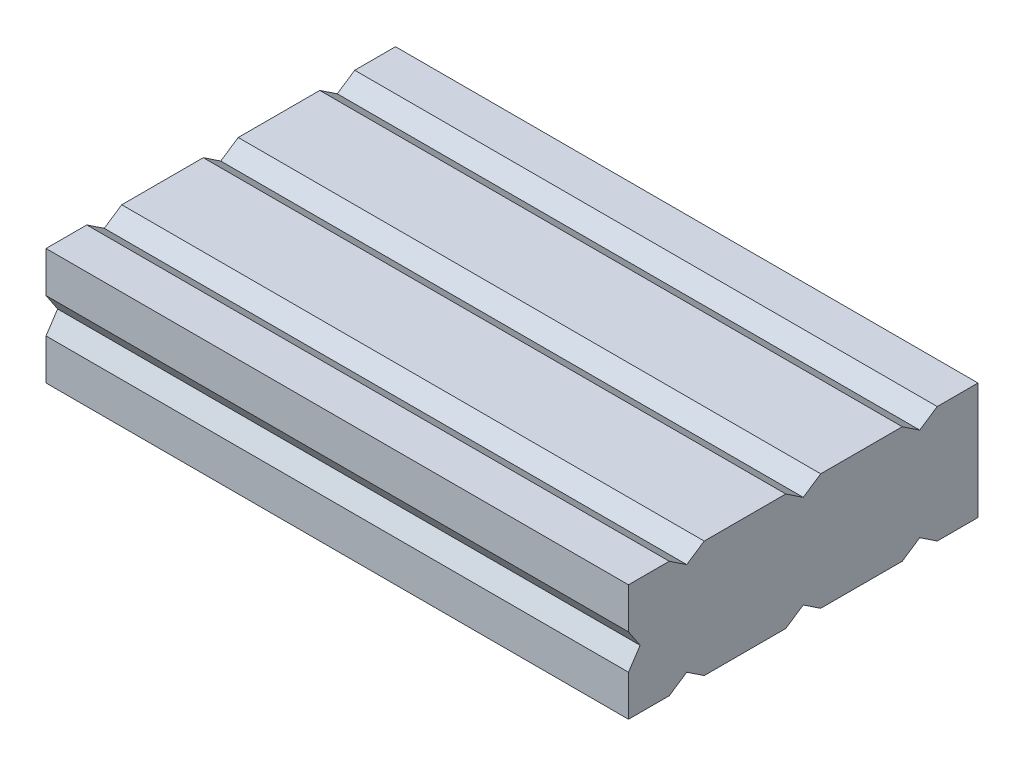
ISO-10303-21;
HEADER;
FILE_DESCRIPTION(('STEP AP214'),'2;1');
FILE_NAME('part.step','',(''),(''),'','','');
FILE_SCHEMA(('AUTOMOTIVE_DESIGN { 1 0 10303 214 1 1 1 1 }'));
ENDSEC;
DATA;
#1=APPLICATION_CONTEXT('core data for automotive mechanical design processes');
#2=APPLICATION_PROTOCOL_DEFINITION('international standard','automotive_design',2000,#1);
#3=PRODUCT_CONTEXT('',#1,'mechanical');
#4=PRODUCT('Part','Part','',(#3));
#5=PRODUCT_RELATED_PRODUCT_CATEGORY('part','',(#4));
#6=PRODUCT_DEFINITION_FORMATION('','',#4);
#7=PRODUCT_DEFINITION_CONTEXT('part definition',#1,'design');
#8=PRODUCT_DEFINITION('design','',#6,#7);
#9=PRODUCT_DEFINITION_SHAPE('','',#8);
#10=(LENGTH_UNIT() NAMED_UNIT(*) SI_UNIT(.MILLI.,.METRE.));
#11=(NAMED_UNIT(*) PLANE_ANGLE_UNIT() SI_UNIT($,.RADIAN.));
#12=(NAMED_UNIT(*) SI_UNIT($,.STERADIAN.) SOLID_ANGLE_UNIT());
#13=UNCERTAINTY_MEASURE_WITH_UNIT(LENGTH_MEASURE(1.E-05),#10,'distance_accuracy_value','');
#14=(GEOMETRIC_REPRESENTATION_CONTEXT(3) GLOBAL_UNCERTAINTY_ASSIGNED_CONTEXT((#13)) GLOBAL_UNIT_ASSIGNED_CONTEXT((#10,
#11,#12)) REPRESENTATION_CONTEXT('',''));
#15=CARTESIAN_POINT('',(0.,0.,0.));
#16=DIRECTION('',(0.,0.,1.));
#17=DIRECTION('',(1.,0.,0.));
#18=AXIS2_PLACEMENT_3D('',#15,#16,#17);
#19=CARTESIAN_POINT('',(100.,-10.,0.));
#20=DIRECTION('',(0.,1.,0.));
#21=DIRECTION('',(0.,0.,1.));
#22=AXIS2_PLACEMENT_3D('',#19,#20,#21);
#23=PLANE('',#22);
#24=DIRECTION('',(0.,0.,-1.));
#25=VECTOR('',#24,1.);
#26=CARTESIAN_POINT('',(0.,-10.,0.));
#27=LINE('',#26,#25);
#28=CARTESIAN_POINT('',(0.,-10.,-13.));
#29=VERTEX_POINT('',#28);
#30=CARTESIAN_POINT('',(0.,-10.,-20.));
#31=VERTEX_POINT('',#30);
#32=EDGE_CURVE('E235',#29,#31,#27,.T.);
#33=ORIENTED_EDGE('',*,*,#32,.T.);
#34=DIRECTION('',(-1.,0.,0.));
#35=VECTOR('',#34,1.);
#36=CARTESIAN_POINT('',(100.,-10.,-20.));
#37=LINE('',#36,#35);
#38=CARTESIAN_POINT('',(100.,-10.,-20.));
#39=VERTEX_POINT('',#38);
#40=EDGE_CURVE('E11',#39,#31,#37,.T.);
#41=ORIENTED_EDGE('',*,*,#40,.F.);
#42=DIRECTION('',(0.,0.,-1.));
#43=VECTOR('',#42,1.);
#44=CARTESIAN_POINT('',(100.,-10.,0.));
#45=LINE('',#44,#43);
#46=CARTESIAN_POINT('',(100.,-10.,-13.));
#47=VERTEX_POINT('',#46);
#48=EDGE_CURVE('E307',#47,#39,#45,.T.);
#49=ORIENTED_EDGE('',*,*,#48,.F.);
#50=DIRECTION('',(-1.,0.,0.));
#51=VECTOR('',#50,1.);
#52=CARTESIAN_POINT('',(100.,-10.,-13.));
#53=LINE('',#52,#51);
#54=EDGE_CURVE('E53',#47,#29,#53,.T.);
#55=ORIENTED_EDGE('',*,*,#54,.T.);
#56=EDGE_LOOP('',(#33,#41,#49,#55));
#57=FACE_BOUND('',#56,.T.);
#58=ADVANCED_FACE('F36',(#57),#23,.F.);
#59=CARTESIAN_POINT('',(100.,0.,-20.));
#60=DIRECTION('',(0.,0.,1.));
#61=DIRECTION('',(1.,0.,0.));
#62=AXIS2_PLACEMENT_3D('',#59,#60,#61);
#63=PLANE('',#62);
#64=DIRECTION('',(0.,1.,0.));
#65=VECTOR('',#64,1.);
#66=CARTESIAN_POINT('',(0.,0.,-20.));
#67=LINE('',#66,#65);
#68=CARTESIAN_POINT('',(0.,10.,-20.));
#69=VERTEX_POINT('',#68);
#70=EDGE_CURVE('E237',#31,#69,#67,.T.);
#71=ORIENTED_EDGE('',*,*,#70,.T.);
#72=DIRECTION('',(-1.,0.,0.));
#73=VECTOR('',#72,1.);
#74=CARTESIAN_POINT('',(100.,10.,-20.));
#75=LINE('',#74,#73);
#76=CARTESIAN_POINT('',(100.,10.,-20.));
#77=VERTEX_POINT('',#76);
#78=EDGE_CURVE('E45',#77,#69,#75,.T.);
#79=ORIENTED_EDGE('',*,*,#78,.F.);
#80=DIRECTION('',(0.,1.,0.));
#81=VECTOR('',#80,1.);
#82=CARTESIAN_POINT('',(100.,0.,-20.));
#83=LINE('',#82,#81);
#84=EDGE_CURVE('E143',#39,#77,#83,.T.);
#85=ORIENTED_EDGE('',*,*,#84,.F.);
#86=ORIENTED_EDGE('',*,*,#40,.T.);
#87=EDGE_LOOP('',(#71,#79,#85,#86));
#88=FACE_BOUND('',#87,.T.);
#89=ADVANCED_FACE('F371',(#88),#63,.F.);
#90=CARTESIAN_POINT('',(100.,10.,0.));
#91=DIRECTION('',(0.,1.,0.));
#92=DIRECTION('',(0.,0.,1.));
#93=AXIS2_PLACEMENT_3D('',#90,#91,#92);
#94=PLANE('',#93);
#95=DIRECTION('',(0.,0.,-1.));
#96=VECTOR('',#95,1.);
#97=CARTESIAN_POINT('',(0.,10.,0.));
#98=LINE('',#97,#96);
#99=CARTESIAN_POINT('',(0.,10.,-13.));
#100=VERTEX_POINT('',#99);
#101=EDGE_CURVE('E240',#100,#69,#98,.T.);
#102=ORIENTED_EDGE('',*,*,#101,.F.);
#103=DIRECTION('',(-1.,0.,0.));
#104=VECTOR('',#103,1.);
#105=CARTESIAN_POINT('',(100.,10.,-13.));
#106=LINE('',#105,#104);
#107=CARTESIAN_POINT('',(100.,10.,-13.));
#108=VERTEX_POINT('',#107);
#109=EDGE_CURVE('E361',#108,#100,#106,.T.);
#110=ORIENTED_EDGE('',*,*,#109,.F.);
#111=DIRECTION('',(0.,0.,-1.));
#112=VECTOR('',#111,1.);
#113=CARTESIAN_POINT('',(100.,10.,0.));
#114=LINE('',#113,#112);
#115=EDGE_CURVE('E370',#108,#77,#114,.T.);
#116=ORIENTED_EDGE('',*,*,#115,.T.);
#117=ORIENTED_EDGE('',*,*,#78,.T.);
#118=EDGE_LOOP('',(#102,#110,#116,#117));
#119=FACE_BOUND('',#118,.T.);
#120=ADVANCED_FACE('F368',(#119),#94,.T.);
#121=CARTESIAN_POINT('',(100.,0.923076923076924,0.615384615384616));
#122=DIRECTION('',(0.,-0.832050294337844,-0.554700196225229));
#123=DIRECTION('',(0.,0.554700196225229,-0.832050294337844));
#124=AXIS2_PLACEMENT_3D('',#121,#122,#123);
#125=PLANE('',#124);
#126=DIRECTION('',(0.,-0.554700196225229,0.832050294337844));
#127=VECTOR('',#126,1.);
#128=CARTESIAN_POINT('',(0.,0.923076923076924,0.615384615384616));
#129=LINE('',#128,#127);
#130=CARTESIAN_POINT('',(0.,8.,-10.));
#131=VERTEX_POINT('',#130);
#132=EDGE_CURVE('E243',#100,#131,#129,.T.);
#133=ORIENTED_EDGE('',*,*,#132,.T.);
#134=DIRECTION('',(-1.,0.,0.));
#135=VECTOR('',#134,1.);
#136=CARTESIAN_POINT('',(100.,8.,-10.));
#137=LINE('',#136,#135);
#138=CARTESIAN_POINT('',(100.,8.,-10.));
#139=VERTEX_POINT('',#138);
#140=EDGE_CURVE('E358',#139,#131,#137,.T.);
#141=ORIENTED_EDGE('',*,*,#140,.F.);
#142=DIRECTION('',(0.,-0.554700196225229,0.832050294337844));
#143=VECTOR('',#142,1.);
#144=CARTESIAN_POINT('',(100.,0.923076923076924,0.615384615384616));
#145=LINE('',#144,#143);
#146=EDGE_CURVE('E382',#108,#139,#145,.T.);
#147=ORIENTED_EDGE('',*,*,#146,.F.);
#148=ORIENTED_EDGE('',*,*,#109,.T.);
#149=EDGE_LOOP('',(#133,#141,#147,#148));
#150=FACE_BOUND('',#149,.T.);
#151=ADVANCED_FACE('F379',(#150),#125,.F.);
#152=CARTESIAN_POINT('',(100.,10.1538461538462,-6.76923076923077));
#153=DIRECTION('',(0.,0.832050294337844,-0.554700196225229));
#154=DIRECTION('',(0.,0.554700196225229,0.832050294337844));
#155=AXIS2_PLACEMENT_3D('',#152,#153,#154);
#156=PLANE('',#155);
#157=DIRECTION('',(0.,-0.554700196225229,-0.832050294337844));
#158=VECTOR('',#157,1.);
#159=CARTESIAN_POINT('',(0.,10.1538461538462,-6.76923076923077));
#160=LINE('',#159,#158);
#161=CARTESIAN_POINT('',(0.,10.,-7.00000000000001));
#162=VERTEX_POINT('',#161);
#163=EDGE_CURVE('E246',#162,#131,#160,.T.);
#164=ORIENTED_EDGE('',*,*,#163,.F.);
#165=DIRECTION('',(-1.,0.,0.));
#166=VECTOR('',#165,1.);
#167=CARTESIAN_POINT('',(100.,10.,-7.00000000000001));
#168=LINE('',#167,#166);
#169=CARTESIAN_POINT('',(100.,10.,-7.00000000000001));
#170=VERTEX_POINT('',#169);
#171=EDGE_CURVE('E355',#170,#162,#168,.T.);
#172=ORIENTED_EDGE('',*,*,#171,.F.);
#173=DIRECTION('',(0.,-0.554700196225229,-0.832050294337844));
#174=VECTOR('',#173,1.);
#175=CARTESIAN_POINT('',(100.,10.1538461538462,-6.76923076923077));
#176=LINE('',#175,#174);
#177=EDGE_CURVE('E384',#170,#139,#176,.T.);
#178=ORIENTED_EDGE('',*,*,#177,.T.);
#179=ORIENTED_EDGE('',*,*,#140,.T.);
#180=EDGE_LOOP('',(#164,#172,#178,#179));
#181=FACE_BOUND('',#180,.T.);
#182=ADVANCED_FACE('F459',(#181),#156,.T.);
#183=CARTESIAN_POINT('',(100.,10.,0.));
#184=DIRECTION('',(0.,1.,0.));
#185=DIRECTION('',(0.,0.,1.));
#186=AXIS2_PLACEMENT_3D('',#183,#184,#185);
#187=PLANE('',#186);
#188=DIRECTION('',(0.,0.,-1.));
#189=VECTOR('',#188,1.);
#190=CARTESIAN_POINT('',(0.,10.,0.));
#191=LINE('',#190,#189);
#192=CARTESIAN_POINT('',(0.,10.,6.99999999999999));
#193=VERTEX_POINT('',#192);
#194=EDGE_CURVE('E249',#193,#162,#191,.T.);
#195=ORIENTED_EDGE('',*,*,#194,.F.);
#196=DIRECTION('',(-1.,0.,0.));
#197=VECTOR('',#196,1.);
#198=CARTESIAN_POINT('',(100.,10.,6.99999999999999));
#199=LINE('',#198,#197);
#200=CARTESIAN_POINT('',(100.,10.,6.99999999999999));
#201=VERTEX_POINT('',#200);
#202=EDGE_CURVE('E352',#201,#193,#199,.T.);
#203=ORIENTED_EDGE('',*,*,#202,.F.);
#204=DIRECTION('',(0.,0.,-1.));
#205=VECTOR('',#204,1.);
#206=CARTESIAN_POINT('',(100.,10.,0.));
#207=LINE('',#206,#205);
#208=EDGE_CURVE('E392',#201,#170,#207,.T.);
#209=ORIENTED_EDGE('',*,*,#208,.T.);
#210=ORIENTED_EDGE('',*,*,#171,.T.);
#211=EDGE_LOOP('',(#195,#203,#209,#210));
#212=FACE_BOUND('',#211,.T.);
#213=ADVANCED_FACE('F462',(#212),#187,.T.);
#214=CARTESIAN_POINT('',(100.,10.1538461538462,6.76923076923076));
#215=DIRECTION('',(0.,-0.832050294337844,-0.554700196225229));
#216=DIRECTION('',(0.,0.554700196225229,-0.832050294337844));
#217=AXIS2_PLACEMENT_3D('',#214,#215,#216);
#218=PLANE('',#217);
#219=DIRECTION('',(0.,-0.554700196225229,0.832050294337844));
#220=VECTOR('',#219,1.);
#221=CARTESIAN_POINT('',(0.,10.1538461538462,6.76923076923076));
#222=LINE('',#221,#220);
#223=CARTESIAN_POINT('',(0.,8.,9.99999999999999));
#224=VERTEX_POINT('',#223);
#225=EDGE_CURVE('E253',#193,#224,#222,.T.);
#226=ORIENTED_EDGE('',*,*,#225,.T.);
#227=DIRECTION('',(-1.,0.,0.));
#228=VECTOR('',#227,1.);
#229=CARTESIAN_POINT('',(100.,8.,9.99999999999999));
#230=LINE('',#229,#228);
#231=CARTESIAN_POINT('',(100.,8.,9.99999999999999));
#232=VERTEX_POINT('',#231);
#233=EDGE_CURVE('E349',#232,#224,#230,.T.);
#234=ORIENTED_EDGE('',*,*,#233,.F.);
#235=DIRECTION('',(0.,-0.554700196225229,0.832050294337844));
#236=VECTOR('',#235,1.);
#237=CARTESIAN_POINT('',(100.,10.1538461538462,6.76923076923076));
#238=LINE('',#237,#236);
#239=EDGE_CURVE('E395',#201,#232,#238,.T.);
#240=ORIENTED_EDGE('',*,*,#239,.F.);
#241=ORIENTED_EDGE('',*,*,#202,.T.);
#242=EDGE_LOOP('',(#226,#234,#240,#241));
#243=FACE_BOUND('',#242,.T.);
#244=ADVANCED_FACE('F466',(#243),#218,.F.);
#245=CARTESIAN_POINT('',(100.,0.923076923076932,-0.615384615384621));
#246=DIRECTION('',(0.,0.832050294337844,-0.554700196225229));
#247=DIRECTION('',(0.,0.554700196225229,0.832050294337844));
#248=AXIS2_PLACEMENT_3D('',#245,#246,#247);
#249=PLANE('',#248);
#250=DIRECTION('',(0.,-0.554700196225229,-0.832050294337844));
#251=VECTOR('',#250,1.);
#252=CARTESIAN_POINT('',(0.,0.923076923076932,-0.615384615384621));
#253=LINE('',#252,#251);
#254=CARTESIAN_POINT('',(0.,10.,13.));
#255=VERTEX_POINT('',#254);
#256=EDGE_CURVE('E256',#255,#224,#253,.T.);
#257=ORIENTED_EDGE('',*,*,#256,.F.);
#258=DIRECTION('',(-1.,0.,0.));
#259=VECTOR('',#258,1.);
#260=CARTESIAN_POINT('',(100.,10.,13.));
#261=LINE('',#260,#259);
#262=CARTESIAN_POINT('',(100.,10.,13.));
#263=VERTEX_POINT('',#262);
#264=EDGE_CURVE('E347',#263,#255,#261,.T.);
#265=ORIENTED_EDGE('',*,*,#264,.F.);
#266=DIRECTION('',(0.,-0.554700196225229,-0.832050294337844));
#267=VECTOR('',#266,1.);
#268=CARTESIAN_POINT('',(100.,0.923076923076932,-0.615384615384621));
#269=LINE('',#268,#267);
#270=EDGE_CURVE('E397',#263,#232,#269,.T.);
#271=ORIENTED_EDGE('',*,*,#270,.T.);
#272=ORIENTED_EDGE('',*,*,#233,.T.);
#273=EDGE_LOOP('',(#257,#265,#271,#272));
#274=FACE_BOUND('',#273,.T.);
#275=ADVANCED_FACE('F470',(#274),#249,.T.);
#276=CARTESIAN_POINT('',(100.,10.,0.));
#277=DIRECTION('',(0.,1.,0.));
#278=DIRECTION('',(0.,0.,1.));
#279=AXIS2_PLACEMENT_3D('',#276,#277,#278);
#280=PLANE('',#279);
#281=DIRECTION('',(0.,0.,-1.));
#282=VECTOR('',#281,1.);
#283=CARTESIAN_POINT('',(0.,10.,0.));
#284=LINE('',#283,#282);
#285=CARTESIAN_POINT('',(0.,10.,27.));
#286=VERTEX_POINT('',#285);
#287=EDGE_CURVE('E259',#286,#255,#284,.T.);
#288=ORIENTED_EDGE('',*,*,#287,.F.);
#289=DIRECTION('',(-1.,0.,0.));
#290=VECTOR('',#289,1.);
#291=CARTESIAN_POINT('',(100.,10.,27.));
#292=LINE('',#291,#290);
#293=CARTESIAN_POINT('',(100.,10.,27.));
#294=VERTEX_POINT('',#293);
#295=EDGE_CURVE('E344',#294,#286,#292,.T.);
#296=ORIENTED_EDGE('',*,*,#295,.F.);
#297=DIRECTION('',(0.,0.,-1.));
#298=VECTOR('',#297,1.);
#299=CARTESIAN_POINT('',(100.,10.,0.));
#300=LINE('',#299,#298);
#301=EDGE_CURVE('E401',#294,#263,#300,.T.);
#302=ORIENTED_EDGE('',*,*,#301,.T.);
#303=ORIENTED_EDGE('',*,*,#264,.T.);
#304=EDGE_LOOP('',(#288,#296,#302,#303));
#305=FACE_BOUND('',#304,.T.);
#306=ADVANCED_FACE('F474',(#305),#280,.T.);
#307=CARTESIAN_POINT('',(100.,19.3846153846154,12.9230769230769));
#308=DIRECTION('',(0.,-0.832050294337844,-0.554700196225229));
#309=DIRECTION('',(0.,0.554700196225229,-0.832050294337844));
#310=AXIS2_PLACEMENT_3D('',#307,#308,#309);
#311=PLANE('',#310);
#312=DIRECTION('',(0.,-0.554700196225229,0.832050294337844));
#313=VECTOR('',#312,1.);
#314=CARTESIAN_POINT('',(0.,19.3846153846154,12.9230769230769));
#315=LINE('',#314,#313);
#316=CARTESIAN_POINT('',(0.,8.,30.));
#317=VERTEX_POINT('',#316);
#318=EDGE_CURVE('E263',#286,#317,#315,.T.);
#319=ORIENTED_EDGE('',*,*,#318,.T.);
#320=DIRECTION('',(-1.,0.,0.));
#321=VECTOR('',#320,1.);
#322=CARTESIAN_POINT('',(100.,8.,30.));
#323=LINE('',#322,#321);
#324=CARTESIAN_POINT('',(100.,8.,30.));
#325=VERTEX_POINT('',#324);
#326=EDGE_CURVE('E341',#325,#317,#323,.T.);
#327=ORIENTED_EDGE('',*,*,#326,.F.);
#328=DIRECTION('',(0.,-0.554700196225229,0.832050294337844));
#329=VECTOR('',#328,1.);
#330=CARTESIAN_POINT('',(100.,19.3846153846154,12.9230769230769));
#331=LINE('',#330,#329);
#332=EDGE_CURVE('E404',#294,#325,#331,.T.);
#333=ORIENTED_EDGE('',*,*,#332,.F.);
#334=ORIENTED_EDGE('',*,*,#295,.T.);
#335=EDGE_LOOP('',(#319,#327,#333,#334));
#336=FACE_BOUND('',#335,.T.);
#337=ADVANCED_FACE('F478',(#336),#311,.F.);
#338=CARTESIAN_POINT('',(100.,-8.3076923076923,5.53846153846153));
#339=DIRECTION('',(0.,0.832050294337844,-0.554700196225229));
#340=DIRECTION('',(0.,0.554700196225229,0.832050294337844));
#341=AXIS2_PLACEMENT_3D('',#338,#339,#340);
#342=PLANE('',#341);
#343=DIRECTION('',(0.,-0.554700196225229,-0.832050294337844));
#344=VECTOR('',#343,1.);
#345=CARTESIAN_POINT('',(0.,-8.3076923076923,5.53846153846153));
#346=LINE('',#345,#344);
#347=CARTESIAN_POINT('',(0.,10.,33.));
#348=VERTEX_POINT('',#347);
#349=EDGE_CURVE('E266',#348,#317,#346,.T.);
#350=ORIENTED_EDGE('',*,*,#349,.F.);
#351=DIRECTION('',(-1.,0.,0.));
#352=VECTOR('',#351,1.);
#353=CARTESIAN_POINT('',(100.,10.,33.));
#354=LINE('',#353,#352);
#355=CARTESIAN_POINT('',(100.,10.,33.));
#356=VERTEX_POINT('',#355);
#357=EDGE_CURVE('E339',#356,#348,#354,.T.);
#358=ORIENTED_EDGE('',*,*,#357,.F.);
#359=DIRECTION('',(0.,-0.554700196225229,-0.832050294337844));
#360=VECTOR('',#359,1.);
#361=CARTESIAN_POINT('',(100.,-8.3076923076923,5.53846153846153));
#362=LINE('',#361,#360);
#363=EDGE_CURVE('E406',#356,#325,#362,.T.);
#364=ORIENTED_EDGE('',*,*,#363,.T.);
#365=ORIENTED_EDGE('',*,*,#326,.T.);
#366=EDGE_LOOP('',(#350,#358,#364,#365));
#367=FACE_BOUND('',#366,.T.);
#368=ADVANCED_FACE('F482',(#367),#342,.T.);
#369=CARTESIAN_POINT('',(100.,10.,0.));
#370=DIRECTION('',(0.,1.,0.));
#371=DIRECTION('',(0.,0.,1.));
#372=AXIS2_PLACEMENT_3D('',#369,#370,#371);
#373=PLANE('',#372);
#374=DIRECTION('',(0.,0.,-1.));
#375=VECTOR('',#374,1.);
#376=CARTESIAN_POINT('',(0.,10.,0.));
#377=LINE('',#376,#375);
#378=CARTESIAN_POINT('',(0.,10.,40.));
#379=VERTEX_POINT('',#378);
#380=EDGE_CURVE('E269',#379,#348,#377,.T.);
#381=ORIENTED_EDGE('',*,*,#380,.F.);
#382=DIRECTION('',(-1.,0.,0.));
#383=VECTOR('',#382,1.);
#384=CARTESIAN_POINT('',(100.,10.,40.));
#385=LINE('',#384,#383);
#386=CARTESIAN_POINT('',(100.,10.,40.));
#387=VERTEX_POINT('',#386);
#388=EDGE_CURVE('E336',#387,#379,#385,.T.);
#389=ORIENTED_EDGE('',*,*,#388,.F.);
#390=DIRECTION('',(0.,0.,-1.));
#391=VECTOR('',#390,1.);
#392=CARTESIAN_POINT('',(100.,10.,0.));
#393=LINE('',#392,#391);
#394=EDGE_CURVE('E409',#387,#356,#393,.T.);
#395=ORIENTED_EDGE('',*,*,#394,.T.);
#396=ORIENTED_EDGE('',*,*,#357,.T.);
#397=EDGE_LOOP('',(#381,#389,#395,#396));
#398=FACE_BOUND('',#397,.T.);
#399=ADVANCED_FACE('F486',(#398),#373,.T.);
#400=CARTESIAN_POINT('',(100.,0.,40.));
#401=DIRECTION('',(0.,0.,1.));
#402=DIRECTION('',(1.,0.,0.));
#403=AXIS2_PLACEMENT_3D('',#400,#401,#402);
#404=PLANE('',#403);
#405=DIRECTION('',(0.,1.,0.));
#406=VECTOR('',#405,1.);
#407=CARTESIAN_POINT('',(0.,0.,40.));
#408=LINE('',#407,#406);
#409=CARTESIAN_POINT('',(0.,3.,40.));
#410=VERTEX_POINT('',#409);
#411=EDGE_CURVE('E272',#410,#379,#408,.T.);
#412=ORIENTED_EDGE('',*,*,#411,.F.);
#413=DIRECTION('',(-1.,0.,0.));
#414=VECTOR('',#413,1.);
#415=CARTESIAN_POINT('',(100.,3.,40.));
#416=LINE('',#415,#414);
#417=CARTESIAN_POINT('',(100.,3.,40.));
#418=VERTEX_POINT('',#417);
#419=EDGE_CURVE('E333',#418,#410,#416,.T.);
#420=ORIENTED_EDGE('',*,*,#419,.F.);
#421=DIRECTION('',(0.,1.,0.));
#422=VECTOR('',#421,1.);
#423=CARTESIAN_POINT('',(100.,0.,40.));
#424=LINE('',#423,#422);
#425=EDGE_CURVE('E412',#418,#387,#424,.T.);
#426=ORIENTED_EDGE('',*,*,#425,.T.);
#427=ORIENTED_EDGE('',*,*,#388,.T.);
#428=EDGE_LOOP('',(#412,#420,#426,#427));
#429=FACE_BOUND('',#428,.T.);
#430=ADVANCED_FACE('F490',(#429),#404,.T.);
#431=CARTESIAN_POINT('',(100.,-17.5384615384615,26.3076923076923));
#432=DIRECTION('',(0.,0.554700196225229,-0.832050294337843));
#433=DIRECTION('',(0.,0.832050294337843,0.554700196225229));
#434=AXIS2_PLACEMENT_3D('',#431,#432,#433);
#435=PLANE('',#434);
#436=DIRECTION('',(0.,-0.832050294337843,-0.554700196225229));
#437=VECTOR('',#436,1.);
#438=CARTESIAN_POINT('',(0.,-17.5384615384615,26.3076923076923));
#439=LINE('',#438,#437);
#440=CARTESIAN_POINT('',(0.,0.,38.));
#441=VERTEX_POINT('',#440);
#442=EDGE_CURVE('E275',#410,#441,#439,.T.);
#443=ORIENTED_EDGE('',*,*,#442,.T.);
#444=DIRECTION('',(-1.,0.,0.));
#445=VECTOR('',#444,1.);
#446=CARTESIAN_POINT('',(100.,0.,38.));
#447=LINE('',#446,#445);
#448=CARTESIAN_POINT('',(100.,0.,38.));
#449=VERTEX_POINT('',#448);
#450=EDGE_CURVE('E330',#449,#441,#447,.T.);
#451=ORIENTED_EDGE('',*,*,#450,.F.);
#452=DIRECTION('',(0.,-0.832050294337843,-0.554700196225229));
#453=VECTOR('',#452,1.);
#454=CARTESIAN_POINT('',(100.,-17.5384615384615,26.3076923076923));
#455=LINE('',#454,#453);
#456=EDGE_CURVE('E415',#418,#449,#455,.T.);
#457=ORIENTED_EDGE('',*,*,#456,.F.);
#458=ORIENTED_EDGE('',*,*,#419,.T.);
#459=EDGE_LOOP('',(#443,#451,#457,#458));
#460=FACE_BOUND('',#459,.T.);
#461=ADVANCED_FACE('F494',(#460),#435,.F.);
#462=CARTESIAN_POINT('',(100.,17.5384615384616,26.3076923076922));
#463=DIRECTION('',(0.,0.554700196225231,0.832050294337843));
#464=DIRECTION('',(0.,-0.832050294337843,0.554700196225231));
#465=AXIS2_PLACEMENT_3D('',#462,#463,#464);
#466=PLANE('',#465);
#467=DIRECTION('',(0.,0.832050294337843,-0.554700196225231));
#468=VECTOR('',#467,1.);
#469=CARTESIAN_POINT('',(0.,17.5384615384616,26.3076923076922));
#470=LINE('',#469,#468);
#471=CARTESIAN_POINT('',(0.,-3.,40.));
#472=VERTEX_POINT('',#471);
#473=EDGE_CURVE('E278',#472,#441,#470,.T.);
#474=ORIENTED_EDGE('',*,*,#473,.F.);
#475=DIRECTION('',(-1.,0.,0.));
#476=VECTOR('',#475,1.);
#477=CARTESIAN_POINT('',(100.,-3.,40.));
#478=LINE('',#477,#476);
#479=CARTESIAN_POINT('',(100.,-3.,40.));
#480=VERTEX_POINT('',#479);
#481=EDGE_CURVE('E327',#480,#472,#478,.T.);
#482=ORIENTED_EDGE('',*,*,#481,.F.);
#483=DIRECTION('',(0.,0.832050294337843,-0.554700196225231));
#484=VECTOR('',#483,1.);
#485=CARTESIAN_POINT('',(100.,17.5384615384616,26.3076923076922));
#486=LINE('',#485,#484);
#487=EDGE_CURVE('E417',#480,#449,#486,.T.);
#488=ORIENTED_EDGE('',*,*,#487,.T.);
#489=ORIENTED_EDGE('',*,*,#450,.T.);
#490=EDGE_LOOP('',(#474,#482,#488,#489));
#491=FACE_BOUND('',#490,.T.);
#492=ADVANCED_FACE('F498',(#491),#466,.T.);
#493=CARTESIAN_POINT('',(100.,0.,40.));
#494=DIRECTION('',(0.,0.,1.));
#495=DIRECTION('',(1.,0.,0.));
#496=AXIS2_PLACEMENT_3D('',#493,#494,#495);
#497=PLANE('',#496);
#498=DIRECTION('',(0.,1.,0.));
#499=VECTOR('',#498,1.);
#500=CARTESIAN_POINT('',(0.,0.,40.));
#501=LINE('',#500,#499);
#502=CARTESIAN_POINT('',(0.,-10.,40.));
#503=VERTEX_POINT('',#502);
#504=EDGE_CURVE('E281',#503,#472,#501,.T.);
#505=ORIENTED_EDGE('',*,*,#504,.F.);
#506=DIRECTION('',(-1.,0.,0.));
#507=VECTOR('',#506,1.);
#508=CARTESIAN_POINT('',(100.,-10.,40.));
#509=LINE('',#508,#507);
#510=CARTESIAN_POINT('',(100.,-10.,40.));
#511=VERTEX_POINT('',#510);
#512=EDGE_CURVE('E325',#511,#503,#509,.T.);
#513=ORIENTED_EDGE('',*,*,#512,.F.);
#514=DIRECTION('',(0.,1.,0.));
#515=VECTOR('',#514,1.);
#516=CARTESIAN_POINT('',(100.,0.,40.));
#517=LINE('',#516,#515);
#518=EDGE_CURVE('E420',#511,#480,#517,.T.);
#519=ORIENTED_EDGE('',*,*,#518,.T.);
#520=ORIENTED_EDGE('',*,*,#481,.T.);
#521=EDGE_LOOP('',(#505,#513,#519,#520));
#522=FACE_BOUND('',#521,.T.);
#523=ADVANCED_FACE('F502',(#522),#497,.T.);
#524=CARTESIAN_POINT('',(100.,-10.,0.));
#525=DIRECTION('',(0.,1.,0.));
#526=DIRECTION('',(0.,0.,1.));
#527=AXIS2_PLACEMENT_3D('',#524,#525,#526);
#528=PLANE('',#527);
#529=DIRECTION('',(0.,0.,-1.));
#530=VECTOR('',#529,1.);
#531=CARTESIAN_POINT('',(0.,-10.,0.));
#532=LINE('',#531,#530);
#533=CARTESIAN_POINT('',(0.,-10.,33.));
#534=VERTEX_POINT('',#533);
#535=EDGE_CURVE('E284',#503,#534,#532,.T.);
#536=ORIENTED_EDGE('',*,*,#535,.T.);
#537=DIRECTION('',(-1.,0.,0.));
#538=VECTOR('',#537,1.);
#539=CARTESIAN_POINT('',(100.,-10.,33.));
#540=LINE('',#539,#538);
#541=CARTESIAN_POINT('',(100.,-10.,33.));
#542=VERTEX_POINT('',#541);
#543=EDGE_CURVE('E322',#542,#534,#540,.T.);
#544=ORIENTED_EDGE('',*,*,#543,.F.);
#545=DIRECTION('',(0.,0.,-1.));
#546=VECTOR('',#545,1.);
#547=CARTESIAN_POINT('',(100.,-10.,0.));
#548=LINE('',#547,#546);
#549=EDGE_CURVE('E423',#511,#542,#548,.T.);
#550=ORIENTED_EDGE('',*,*,#549,.F.);
#551=ORIENTED_EDGE('',*,*,#512,.T.);
#552=EDGE_LOOP('',(#536,#544,#550,#551));
#553=FACE_BOUND('',#552,.T.);
#554=ADVANCED_FACE('F506',(#553),#528,.F.);
#555=CARTESIAN_POINT('',(100.,8.30769230769225,5.53846153846147));
#556=DIRECTION('',(0.,0.832050294337845,0.554700196225227));
#557=DIRECTION('',(0.,-0.554700196225227,0.832050294337845));
#558=AXIS2_PLACEMENT_3D('',#555,#556,#557);
#559=PLANE('',#558);
#560=DIRECTION('',(0.,0.554700196225227,-0.832050294337845));
#561=VECTOR('',#560,1.);
#562=CARTESIAN_POINT('',(0.,8.30769230769225,5.53846153846147));
#563=LINE('',#562,#561);
#564=CARTESIAN_POINT('',(0.,-8.,30.));
#565=VERTEX_POINT('',#564);
#566=EDGE_CURVE('E286',#534,#565,#563,.T.);
#567=ORIENTED_EDGE('',*,*,#566,.T.);
#568=DIRECTION('',(-1.,0.,0.));
#569=VECTOR('',#568,1.);
#570=CARTESIAN_POINT('',(100.,-8.,30.));
#571=LINE('',#570,#569);
#572=CARTESIAN_POINT('',(100.,-8.,30.));
#573=VERTEX_POINT('',#572);
#574=EDGE_CURVE('E320',#573,#565,#571,.T.);
#575=ORIENTED_EDGE('',*,*,#574,.F.);
#576=DIRECTION('',(0.,0.554700196225227,-0.832050294337845));
#577=VECTOR('',#576,1.);
#578=CARTESIAN_POINT('',(100.,8.30769230769225,5.53846153846147));
#579=LINE('',#578,#577);
#580=EDGE_CURVE('E425',#542,#573,#579,.T.);
#581=ORIENTED_EDGE('',*,*,#580,.F.);
#582=ORIENTED_EDGE('',*,*,#543,.T.);
#583=EDGE_LOOP('',(#567,#575,#581,#582));
#584=FACE_BOUND('',#583,.T.);
#585=ADVANCED_FACE('F510',(#584),#559,.F.);
#586=CARTESIAN_POINT('',(100.,-19.3846153846154,12.9230769230769));
#587=DIRECTION('',(0.,-0.832050294337844,0.554700196225228));
#588=DIRECTION('',(0.,-0.554700196225228,-0.832050294337844));
#589=AXIS2_PLACEMENT_3D('',#586,#587,#588);
#590=PLANE('',#589);
#591=DIRECTION('',(0.,0.554700196225228,0.832050294337844));
#592=VECTOR('',#591,1.);
#593=CARTESIAN_POINT('',(0.,-19.3846153846154,12.9230769230769));
#594=LINE('',#593,#592);
#595=CARTESIAN_POINT('',(0.,-10.,27.));
#596=VERTEX_POINT('',#595);
#597=EDGE_CURVE('E289',#596,#565,#594,.T.);
#598=ORIENTED_EDGE('',*,*,#597,.F.);
#599=DIRECTION('',(-1.,0.,0.));
#600=VECTOR('',#599,1.);
#601=CARTESIAN_POINT('',(100.,-10.,27.));
#602=LINE('',#601,#600);
#603=CARTESIAN_POINT('',(100.,-10.,27.));
#604=VERTEX_POINT('',#603);
#605=EDGE_CURVE('E317',#604,#596,#602,.T.);
#606=ORIENTED_EDGE('',*,*,#605,.F.);
#607=DIRECTION('',(0.,0.554700196225228,0.832050294337844));
#608=VECTOR('',#607,1.);
#609=CARTESIAN_POINT('',(100.,-19.3846153846154,12.9230769230769));
#610=LINE('',#609,#608);
#611=EDGE_CURVE('E427',#604,#573,#610,.T.);
#612=ORIENTED_EDGE('',*,*,#611,.T.);
#613=ORIENTED_EDGE('',*,*,#574,.T.);
#614=EDGE_LOOP('',(#598,#606,#612,#613));
#615=FACE_BOUND('',#614,.T.);
#616=ADVANCED_FACE('F514',(#615),#590,.T.);
#617=CARTESIAN_POINT('',(100.,-10.,0.));
#618=DIRECTION('',(0.,1.,0.));
#619=DIRECTION('',(0.,0.,1.));
#620=AXIS2_PLACEMENT_3D('',#617,#618,#619);
#621=PLANE('',#620);
#622=DIRECTION('',(0.,0.,-1.));
#623=VECTOR('',#622,1.);
#624=CARTESIAN_POINT('',(0.,-10.,0.));
#625=LINE('',#624,#623);
#626=CARTESIAN_POINT('',(0.,-10.,13.));
#627=VERTEX_POINT('',#626);
#628=EDGE_CURVE('E292',#596,#627,#625,.T.);
#629=ORIENTED_EDGE('',*,*,#628,.T.);
#630=DIRECTION('',(-1.,0.,0.));
#631=VECTOR('',#630,1.);
#632=CARTESIAN_POINT('',(100.,-10.,13.));
#633=LINE('',#632,#631);
#634=CARTESIAN_POINT('',(100.,-10.,13.));
#635=VERTEX_POINT('',#634);
#636=EDGE_CURVE('E313',#635,#627,#633,.T.);
#637=ORIENTED_EDGE('',*,*,#636,.F.);
#638=DIRECTION('',(0.,0.,-1.));
#639=VECTOR('',#638,1.);
#640=CARTESIAN_POINT('',(100.,-10.,0.));
#641=LINE('',#640,#639);
#642=EDGE_CURVE('E430',#604,#635,#641,.T.);
#643=ORIENTED_EDGE('',*,*,#642,.F.);
#644=ORIENTED_EDGE('',*,*,#605,.T.);
#645=EDGE_LOOP('',(#629,#637,#643,#644));
#646=FACE_BOUND('',#645,.T.);
#647=ADVANCED_FACE('F518',(#646),#621,.F.);
#648=CARTESIAN_POINT('',(100.,-0.923076923076937,-0.615384615384624));
#649=DIRECTION('',(0.,0.832050294337844,0.554700196225229));
#650=DIRECTION('',(0.,-0.554700196225229,0.832050294337844));
#651=AXIS2_PLACEMENT_3D('',#648,#649,#650);
#652=PLANE('',#651);
#653=DIRECTION('',(0.,0.554700196225229,-0.832050294337844));
#654=VECTOR('',#653,1.);
#655=CARTESIAN_POINT('',(0.,-0.923076923076937,-0.615384615384624));
#656=LINE('',#655,#654);
#657=CARTESIAN_POINT('',(0.,-8.,9.99999999999999));
#658=VERTEX_POINT('',#657);
#659=EDGE_CURVE('E294',#627,#658,#656,.T.);
#660=ORIENTED_EDGE('',*,*,#659,.T.);
#661=DIRECTION('',(-1.,0.,0.));
#662=VECTOR('',#661,1.);
#663=CARTESIAN_POINT('',(100.,-8.,9.99999999999999));
#664=LINE('',#663,#662);
#665=CARTESIAN_POINT('',(100.,-8.,9.99999999999999));
#666=VERTEX_POINT('',#665);
#667=EDGE_CURVE('E311',#666,#658,#664,.T.);
#668=ORIENTED_EDGE('',*,*,#667,.F.);
#669=DIRECTION('',(0.,0.554700196225229,-0.832050294337844));
#670=VECTOR('',#669,1.);
#671=CARTESIAN_POINT('',(100.,-0.923076923076937,-0.615384615384624));
#672=LINE('',#671,#670);
#673=EDGE_CURVE('E432',#635,#666,#672,.T.);
#674=ORIENTED_EDGE('',*,*,#673,.F.);
#675=ORIENTED_EDGE('',*,*,#636,.T.);
#676=EDGE_LOOP('',(#660,#668,#674,#675));
#677=FACE_BOUND('',#676,.T.);
#678=ADVANCED_FACE('F522',(#677),#652,.F.);
#679=CARTESIAN_POINT('',(100.,-10.1538461538461,6.76923076923077));
#680=DIRECTION('',(0.,-0.832050294337844,0.554700196225229));
#681=DIRECTION('',(0.,-0.554700196225229,-0.832050294337843));
#682=AXIS2_PLACEMENT_3D('',#679,#680,#681);
#683=PLANE('',#682);
#684=DIRECTION('',(0.,0.554700196225229,0.832050294337844));
#685=VECTOR('',#684,1.);
#686=CARTESIAN_POINT('',(0.,-10.1538461538461,6.76923076923077));
#687=LINE('',#686,#685);
#688=CARTESIAN_POINT('',(0.,-10.,6.99999999999999));
#689=VERTEX_POINT('',#688);
#690=EDGE_CURVE('E298',#689,#658,#687,.T.);
#691=ORIENTED_EDGE('',*,*,#690,.F.);
#692=DIRECTION('',(-1.,0.,0.));
#693=VECTOR('',#692,1.);
#694=CARTESIAN_POINT('',(100.,-10.,6.99999999999999));
#695=LINE('',#694,#693);
#696=CARTESIAN_POINT('',(100.,-10.,6.99999999999999));
#697=VERTEX_POINT('',#696);
#698=EDGE_CURVE('E227',#697,#689,#695,.T.);
#699=ORIENTED_EDGE('',*,*,#698,.F.);
#700=DIRECTION('',(0.,0.554700196225229,0.832050294337844));
#701=VECTOR('',#700,1.);
#702=CARTESIAN_POINT('',(100.,-10.1538461538461,6.76923076923077));
#703=LINE('',#702,#701);
#704=EDGE_CURVE('E217',#697,#666,#703,.T.);
#705=ORIENTED_EDGE('',*,*,#704,.T.);
#706=ORIENTED_EDGE('',*,*,#667,.T.);
#707=EDGE_LOOP('',(#691,#699,#705,#706));
#708=FACE_BOUND('',#707,.T.);
#709=ADVANCED_FACE('F435',(#708),#683,.T.);
#710=CARTESIAN_POINT('',(100.,-10.,0.));
#711=DIRECTION('',(0.,1.,0.));
#712=DIRECTION('',(0.,0.,1.));
#713=AXIS2_PLACEMENT_3D('',#710,#711,#712);
#714=PLANE('',#713);
#715=DIRECTION('',(0.,0.,-1.));
#716=VECTOR('',#715,1.);
#717=CARTESIAN_POINT('',(0.,-10.,0.));
#718=LINE('',#717,#716);
#719=CARTESIAN_POINT('',(0.,-10.,-7.));
#720=VERTEX_POINT('',#719);
#721=EDGE_CURVE('E224',#689,#720,#718,.T.);
#722=ORIENTED_EDGE('',*,*,#721,.T.);
#723=DIRECTION('',(-1.,0.,0.));
#724=VECTOR('',#723,1.);
#725=CARTESIAN_POINT('',(100.,-10.,-7.));
#726=LINE('',#725,#724);
#727=CARTESIAN_POINT('',(100.,-10.,-7.));
#728=VERTEX_POINT('',#727);
#729=EDGE_CURVE('E221',#728,#720,#726,.T.);
#730=ORIENTED_EDGE('',*,*,#729,.F.);
#731=DIRECTION('',(0.,0.,-1.));
#732=VECTOR('',#731,1.);
#733=CARTESIAN_POINT('',(100.,-10.,0.));
#734=LINE('',#733,#732);
#735=EDGE_CURVE('E210',#697,#728,#734,.T.);
#736=ORIENTED_EDGE('',*,*,#735,.F.);
#737=ORIENTED_EDGE('',*,*,#698,.T.);
#738=EDGE_LOOP('',(#722,#730,#736,#737));
#739=FACE_BOUND('',#738,.T.);
#740=ADVANCED_FACE('F222',(#739),#714,.F.);
#741=CARTESIAN_POINT('',(100.,-10.1538461538462,-6.76923076923078));
#742=DIRECTION('',(0.,0.832050294337843,0.55470019622523));
#743=DIRECTION('',(0.,-0.55470019622523,0.832050294337843));
#744=AXIS2_PLACEMENT_3D('',#741,#742,#743);
#745=PLANE('',#744);
#746=DIRECTION('',(0.,0.55470019622523,-0.832050294337843));
#747=VECTOR('',#746,1.);
#748=CARTESIAN_POINT('',(0.,-10.1538461538462,-6.76923076923078));
#749=LINE('',#748,#747);
#750=CARTESIAN_POINT('',(0.,-8.,-10.));
#751=VERTEX_POINT('',#750);
#752=EDGE_CURVE('E302',#720,#751,#749,.T.);
#753=ORIENTED_EDGE('',*,*,#752,.T.);
#754=DIRECTION('',(-1.,0.,0.));
#755=VECTOR('',#754,1.);
#756=CARTESIAN_POINT('',(100.,-8.,-10.));
#757=LINE('',#756,#755);
#758=CARTESIAN_POINT('',(100.,-8.,-10.));
#759=VERTEX_POINT('',#758);
#760=EDGE_CURVE('E131',#759,#751,#757,.T.);
#761=ORIENTED_EDGE('',*,*,#760,.F.);
#762=DIRECTION('',(0.,0.55470019622523,-0.832050294337843));
#763=VECTOR('',#762,1.);
#764=CARTESIAN_POINT('',(100.,-10.1538461538462,-6.76923076923078));
#765=LINE('',#764,#763);
#766=EDGE_CURVE('E215',#728,#759,#765,.T.);
#767=ORIENTED_EDGE('',*,*,#766,.F.);
#768=ORIENTED_EDGE('',*,*,#729,.T.);
#769=EDGE_LOOP('',(#753,#761,#767,#768));
#770=FACE_BOUND('',#769,.T.);
#771=ADVANCED_FACE('F229',(#770),#745,.F.);
#772=CARTESIAN_POINT('',(100.,-0.923076923076898,0.615384615384601));
#773=DIRECTION('',(0.,-0.832050294337843,0.55470019622523));
#774=DIRECTION('',(0.,-0.55470019622523,-0.832050294337843));
#775=AXIS2_PLACEMENT_3D('',#772,#773,#774);
#776=PLANE('',#775);
#777=DIRECTION('',(0.,0.55470019622523,0.832050294337843));
#778=VECTOR('',#777,1.);
#779=CARTESIAN_POINT('',(0.,-0.923076923076898,0.615384615384601));
#780=LINE('',#779,#778);
#781=EDGE_CURVE('E304',#29,#751,#780,.T.);
#782=ORIENTED_EDGE('',*,*,#781,.F.);
#783=ORIENTED_EDGE('',*,*,#54,.F.);
#784=DIRECTION('',(0.,0.55470019622523,0.832050294337843));
#785=VECTOR('',#784,1.);
#786=CARTESIAN_POINT('',(100.,-0.923076923076898,0.615384615384601));
#787=LINE('',#786,#785);
#788=EDGE_CURVE('E230',#47,#759,#787,.T.);
#789=ORIENTED_EDGE('',*,*,#788,.T.);
#790=ORIENTED_EDGE('',*,*,#760,.T.);
#791=EDGE_LOOP('',(#782,#783,#789,#790));
#792=FACE_BOUND('',#791,.T.);
#793=ADVANCED_FACE('F438',(#792),#776,.T.);
#794=CARTESIAN_POINT('',(100.,0.,0.));
#795=DIRECTION('',(1.,0.,0.));
#796=DIRECTION('',(0.,0.,-1.));
#797=AXIS2_PLACEMENT_3D('',#794,#795,#796);
#798=PLANE('',#797);
#799=ORIENTED_EDGE('',*,*,#48,.T.);
#800=ORIENTED_EDGE('',*,*,#84,.T.);
#801=ORIENTED_EDGE('',*,*,#115,.F.);
#802=ORIENTED_EDGE('',*,*,#146,.T.);
#803=ORIENTED_EDGE('',*,*,#177,.F.);
#804=ORIENTED_EDGE('',*,*,#208,.F.);
#805=ORIENTED_EDGE('',*,*,#239,.T.);
#806=ORIENTED_EDGE('',*,*,#270,.F.);
#807=ORIENTED_EDGE('',*,*,#301,.F.);
#808=ORIENTED_EDGE('',*,*,#332,.T.);
#809=ORIENTED_EDGE('',*,*,#363,.F.);
#810=ORIENTED_EDGE('',*,*,#394,.F.);
#811=ORIENTED_EDGE('',*,*,#425,.F.);
#812=ORIENTED_EDGE('',*,*,#456,.T.);
#813=ORIENTED_EDGE('',*,*,#487,.F.);
#814=ORIENTED_EDGE('',*,*,#518,.F.);
#815=ORIENTED_EDGE('',*,*,#549,.T.);
#816=ORIENTED_EDGE('',*,*,#580,.T.);
#817=ORIENTED_EDGE('',*,*,#611,.F.);
#818=ORIENTED_EDGE('',*,*,#642,.T.);
#819=ORIENTED_EDGE('',*,*,#673,.T.);
#820=ORIENTED_EDGE('',*,*,#704,.F.);
#821=ORIENTED_EDGE('',*,*,#735,.T.);
#822=ORIENTED_EDGE('',*,*,#766,.T.);
#823=ORIENTED_EDGE('',*,*,#788,.F.);
#824=EDGE_LOOP('',(#799,#800,#801,#802,#803,#804,#805,#806,#807,#808,#809,#810,#811,#812,#813,
#814,#815,#816,#817,#818,#819,#820,#821,#822,#823));
#825=FACE_BOUND('',#824,.T.);
#826=ADVANCED_FACE('F212',(#825),#798,.T.);
#827=CARTESIAN_POINT('',(0.,0.,0.));
#828=DIRECTION('',(1.,0.,0.));
#829=DIRECTION('',(0.,0.,-1.));
#830=AXIS2_PLACEMENT_3D('',#827,#828,#829);
#831=PLANE('',#830);
#832=ORIENTED_EDGE('',*,*,#32,.F.);
#833=ORIENTED_EDGE('',*,*,#781,.T.);
#834=ORIENTED_EDGE('',*,*,#752,.F.);
#835=ORIENTED_EDGE('',*,*,#721,.F.);
#836=ORIENTED_EDGE('',*,*,#690,.T.);
#837=ORIENTED_EDGE('',*,*,#659,.F.);
#838=ORIENTED_EDGE('',*,*,#628,.F.);
#839=ORIENTED_EDGE('',*,*,#597,.T.);
#840=ORIENTED_EDGE('',*,*,#566,.F.);
#841=ORIENTED_EDGE('',*,*,#535,.F.);
#842=ORIENTED_EDGE('',*,*,#504,.T.);
#843=ORIENTED_EDGE('',*,*,#473,.T.);
#844=ORIENTED_EDGE('',*,*,#442,.F.);
#845=ORIENTED_EDGE('',*,*,#411,.T.);
#846=ORIENTED_EDGE('',*,*,#380,.T.);
#847=ORIENTED_EDGE('',*,*,#349,.T.);
#848=ORIENTED_EDGE('',*,*,#318,.F.);
#849=ORIENTED_EDGE('',*,*,#287,.T.);
#850=ORIENTED_EDGE('',*,*,#256,.T.);
#851=ORIENTED_EDGE('',*,*,#225,.F.);
#852=ORIENTED_EDGE('',*,*,#194,.T.);
#853=ORIENTED_EDGE('',*,*,#163,.T.);
#854=ORIENTED_EDGE('',*,*,#132,.F.);
#855=ORIENTED_EDGE('',*,*,#101,.T.);
#856=ORIENTED_EDGE('',*,*,#70,.F.);
#857=EDGE_LOOP('',(#832,#833,#834,#835,#836,#837,#838,#839,#840,#841,#842,#843,#844,#845,#846,
#847,#848,#849,#850,#851,#852,#853,#854,#855,#856));
#858=FACE_BOUND('',#857,.T.);
#859=ADVANCED_FACE('F375',(#858),#831,.F.);
#860=CLOSED_SHELL('',(#58,#89,#120,#151,#182,#213,#244,#275,#306,#337,#368,#399,#430,#461,#492,
#523,#554,#585,#616,#647,#678,#709,#740,#771,#793,#826,#859));
#861=MANIFOLD_SOLID_BREP('B2',#860);
#862=ADVANCED_BREP_SHAPE_REPRESENTATION('',(#18,#861),#14);
#863=SHAPE_DEFINITION_REPRESENTATION(#9,#862);
ENDSEC;
END-ISO-10303-21;
